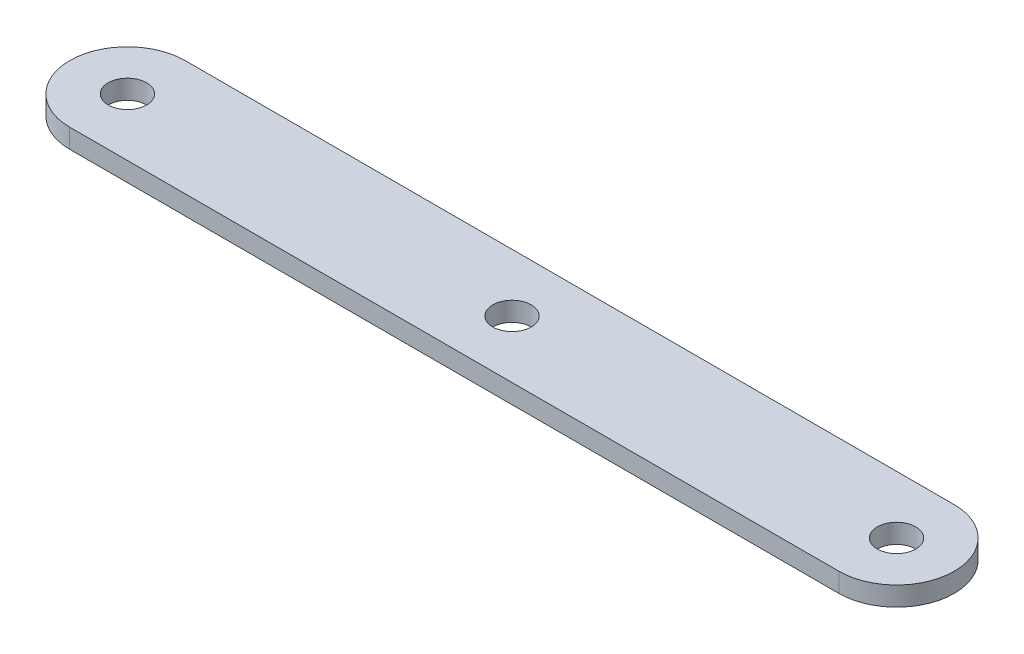
ISO-10303-21;
HEADER;
FILE_DESCRIPTION(('STEP AP214'),'2;1');
FILE_NAME('part.step','',(''),(''),'','','');
FILE_SCHEMA(('AUTOMOTIVE_DESIGN { 1 0 10303 214 1 1 1 1 }'));
ENDSEC;
DATA;
#1=APPLICATION_CONTEXT('core data for automotive mechanical design processes');
#2=APPLICATION_PROTOCOL_DEFINITION('international standard','automotive_design',2000,#1);
#3=PRODUCT_CONTEXT('',#1,'mechanical');
#4=PRODUCT('Part','Part','',(#3));
#5=PRODUCT_RELATED_PRODUCT_CATEGORY('part','',(#4));
#6=PRODUCT_DEFINITION_FORMATION('','',#4);
#7=PRODUCT_DEFINITION_CONTEXT('part definition',#1,'design');
#8=PRODUCT_DEFINITION('design','',#6,#7);
#9=PRODUCT_DEFINITION_SHAPE('','',#8);
#10=(LENGTH_UNIT() NAMED_UNIT(*) SI_UNIT(.MILLI.,.METRE.));
#11=(NAMED_UNIT(*) PLANE_ANGLE_UNIT() SI_UNIT($,.RADIAN.));
#12=(NAMED_UNIT(*) SI_UNIT($,.STERADIAN.) SOLID_ANGLE_UNIT());
#13=UNCERTAINTY_MEASURE_WITH_UNIT(LENGTH_MEASURE(1.E-05),#10,'distance_accuracy_value','');
#14=(GEOMETRIC_REPRESENTATION_CONTEXT(3) GLOBAL_UNCERTAINTY_ASSIGNED_CONTEXT((#13)) GLOBAL_UNIT_ASSIGNED_CONTEXT((#10,
#11,#12)) REPRESENTATION_CONTEXT('',''));
#15=CARTESIAN_POINT('',(0.,0.,0.));
#16=DIRECTION('',(0.,0.,1.));
#17=DIRECTION('',(1.,0.,0.));
#18=AXIS2_PLACEMENT_3D('',#15,#16,#17);
#19=CARTESIAN_POINT('',(0.,5.,0.));
#20=DIRECTION('',(0.,1.,0.));
#21=DIRECTION('',(0.,0.,1.));
#22=AXIS2_PLACEMENT_3D('',#19,#20,#21);
#23=PLANE('',#22);
#24=CARTESIAN_POINT('',(100.,5.,0.));
#25=DIRECTION('',(0.,1.,0.));
#26=DIRECTION('',(0.,0.,1.));
#27=AXIS2_PLACEMENT_3D('',#24,#25,#26);
#28=CIRCLE('',#27,5.);
#29=CARTESIAN_POINT('',(100.,5.,5.));
#30=VERTEX_POINT('',#29);
#31=EDGE_CURVE('E123',#30,#30,#28,.T.);
#32=ORIENTED_EDGE('',*,*,#31,.F.);
#33=EDGE_LOOP('',(#32));
#34=FACE_BOUND('',#33,.T.);
#35=CARTESIAN_POINT('',(0.,5.,0.));
#36=DIRECTION('',(0.,1.,0.));
#37=DIRECTION('',(0.,0.,1.));
#38=AXIS2_PLACEMENT_3D('',#35,#36,#37);
#39=CIRCLE('',#38,15.);
#40=CARTESIAN_POINT('',(0.,5.,-15.));
#41=VERTEX_POINT('',#40);
#42=CARTESIAN_POINT('',(0.,5.,15.));
#43=VERTEX_POINT('',#42);
#44=EDGE_CURVE('E93',#41,#43,#39,.T.);
#45=ORIENTED_EDGE('',*,*,#44,.T.);
#46=DIRECTION('',(1.,0.,0.));
#47=VECTOR('',#46,1.);
#48=CARTESIAN_POINT('',(0.,5.,15.));
#49=LINE('',#48,#47);
#50=CARTESIAN_POINT('',(200.,5.,15.));
#51=VERTEX_POINT('',#50);
#52=EDGE_CURVE('E88',#43,#51,#49,.T.);
#53=ORIENTED_EDGE('',*,*,#52,.T.);
#54=CARTESIAN_POINT('',(200.,5.,0.));
#55=DIRECTION('',(0.,1.,0.));
#56=DIRECTION('',(0.,0.,1.));
#57=AXIS2_PLACEMENT_3D('',#54,#55,#56);
#58=CIRCLE('',#57,15.);
#59=CARTESIAN_POINT('',(200.,5.,-15.));
#60=VERTEX_POINT('',#59);
#61=EDGE_CURVE('E91',#51,#60,#58,.T.);
#62=ORIENTED_EDGE('',*,*,#61,.T.);
#63=DIRECTION('',(-1.,0.,0.));
#64=VECTOR('',#63,1.);
#65=CARTESIAN_POINT('',(0.,5.,-15.));
#66=LINE('',#65,#64);
#67=EDGE_CURVE('E58',#60,#41,#66,.T.);
#68=ORIENTED_EDGE('',*,*,#67,.T.);
#69=EDGE_LOOP('',(#45,#53,#62,#68));
#70=FACE_BOUND('',#69,.T.);
#71=CARTESIAN_POINT('',(200.,5.,0.));
#72=DIRECTION('',(0.,1.,0.));
#73=DIRECTION('',(0.,0.,1.));
#74=AXIS2_PLACEMENT_3D('',#71,#72,#73);
#75=CIRCLE('',#74,4.99999999999999);
#76=CARTESIAN_POINT('',(200.,5.,4.99999999999999));
#77=VERTEX_POINT('',#76);
#78=EDGE_CURVE('E108',#77,#77,#75,.T.);
#79=ORIENTED_EDGE('',*,*,#78,.F.);
#80=EDGE_LOOP('',(#79));
#81=FACE_BOUND('',#80,.T.);
#82=CARTESIAN_POINT('',(0.,5.,0.));
#83=DIRECTION('',(0.,1.,0.));
#84=DIRECTION('',(0.,0.,1.));
#85=AXIS2_PLACEMENT_3D('',#82,#83,#84);
#86=CIRCLE('',#85,5.);
#87=CARTESIAN_POINT('',(0.,5.,5.));
#88=VERTEX_POINT('',#87);
#89=EDGE_CURVE('E129',#88,#88,#86,.T.);
#90=ORIENTED_EDGE('',*,*,#89,.F.);
#91=EDGE_LOOP('',(#90));
#92=FACE_BOUND('',#91,.T.);
#93=ADVANCED_FACE('F41',(#34,#70,#81,#92),#23,.T.);
#94=CARTESIAN_POINT('',(0.,0.,0.));
#95=DIRECTION('',(0.,1.,0.));
#96=DIRECTION('',(0.,0.,1.));
#97=AXIS2_PLACEMENT_3D('',#94,#95,#96);
#98=PLANE('',#97);
#99=CARTESIAN_POINT('',(0.,0.,0.));
#100=DIRECTION('',(0.,1.,0.));
#101=DIRECTION('',(0.,0.,1.));
#102=AXIS2_PLACEMENT_3D('',#99,#100,#101);
#103=CIRCLE('',#102,15.);
#104=CARTESIAN_POINT('',(0.,0.,-15.));
#105=VERTEX_POINT('',#104);
#106=CARTESIAN_POINT('',(0.,0.,15.));
#107=VERTEX_POINT('',#106);
#108=EDGE_CURVE('E105',#105,#107,#103,.T.);
#109=ORIENTED_EDGE('',*,*,#108,.F.);
#110=DIRECTION('',(-1.,0.,0.));
#111=VECTOR('',#110,1.);
#112=CARTESIAN_POINT('',(0.,0.,-15.));
#113=LINE('',#112,#111);
#114=CARTESIAN_POINT('',(200.,0.,-15.));
#115=VERTEX_POINT('',#114);
#116=EDGE_CURVE('E81',#115,#105,#113,.T.);
#117=ORIENTED_EDGE('',*,*,#116,.F.);
#118=CARTESIAN_POINT('',(200.,0.,0.));
#119=DIRECTION('',(0.,1.,0.));
#120=DIRECTION('',(0.,0.,1.));
#121=AXIS2_PLACEMENT_3D('',#118,#119,#120);
#122=CIRCLE('',#121,15.);
#123=CARTESIAN_POINT('',(200.,0.,15.));
#124=VERTEX_POINT('',#123);
#125=EDGE_CURVE('E75',#124,#115,#122,.T.);
#126=ORIENTED_EDGE('',*,*,#125,.F.);
#127=DIRECTION('',(1.,0.,0.));
#128=VECTOR('',#127,1.);
#129=CARTESIAN_POINT('',(0.,0.,15.));
#130=LINE('',#129,#128);
#131=EDGE_CURVE('E97',#107,#124,#130,.T.);
#132=ORIENTED_EDGE('',*,*,#131,.F.);
#133=EDGE_LOOP('',(#109,#117,#126,#132));
#134=FACE_BOUND('',#133,.T.);
#135=CARTESIAN_POINT('',(200.,0.,0.));
#136=DIRECTION('',(0.,1.,0.));
#137=DIRECTION('',(0.,0.,1.));
#138=AXIS2_PLACEMENT_3D('',#135,#136,#137);
#139=CIRCLE('',#138,4.99999999999999);
#140=CARTESIAN_POINT('',(200.,0.,4.99999999999999));
#141=VERTEX_POINT('',#140);
#142=EDGE_CURVE('E120',#141,#141,#139,.T.);
#143=ORIENTED_EDGE('',*,*,#142,.T.);
#144=EDGE_LOOP('',(#143));
#145=FACE_BOUND('',#144,.T.);
#146=CARTESIAN_POINT('',(100.,0.,0.));
#147=DIRECTION('',(0.,1.,0.));
#148=DIRECTION('',(0.,0.,1.));
#149=AXIS2_PLACEMENT_3D('',#146,#147,#148);
#150=CIRCLE('',#149,5.);
#151=CARTESIAN_POINT('',(100.,0.,5.));
#152=VERTEX_POINT('',#151);
#153=EDGE_CURVE('E126',#152,#152,#150,.T.);
#154=ORIENTED_EDGE('',*,*,#153,.T.);
#155=EDGE_LOOP('',(#154));
#156=FACE_BOUND('',#155,.T.);
#157=CARTESIAN_POINT('',(0.,0.,0.));
#158=DIRECTION('',(0.,1.,0.));
#159=DIRECTION('',(0.,0.,1.));
#160=AXIS2_PLACEMENT_3D('',#157,#158,#159);
#161=CIRCLE('',#160,5.);
#162=CARTESIAN_POINT('',(0.,0.,5.));
#163=VERTEX_POINT('',#162);
#164=EDGE_CURVE('E132',#163,#163,#161,.T.);
#165=ORIENTED_EDGE('',*,*,#164,.T.);
#166=EDGE_LOOP('',(#165));
#167=FACE_BOUND('',#166,.T.);
#168=ADVANCED_FACE('F116',(#134,#145,#156,#167),#98,.F.);
#169=CARTESIAN_POINT('',(0.,5.,0.));
#170=DIRECTION('',(0.,-1.,0.));
#171=DIRECTION('',(0.,0.,-1.));
#172=AXIS2_PLACEMENT_3D('',#169,#170,#171);
#173=CYLINDRICAL_SURFACE('',#172,15.);
#174=ORIENTED_EDGE('',*,*,#108,.T.);
#175=DIRECTION('',(0.,-1.,0.));
#176=VECTOR('',#175,1.);
#177=CARTESIAN_POINT('',(0.,5.,15.));
#178=LINE('',#177,#176);
#179=EDGE_CURVE('E11',#43,#107,#178,.T.);
#180=ORIENTED_EDGE('',*,*,#179,.F.);
#181=ORIENTED_EDGE('',*,*,#44,.F.);
#182=DIRECTION('',(0.,-1.,0.));
#183=VECTOR('',#182,1.);
#184=CARTESIAN_POINT('',(0.,5.,-15.));
#185=LINE('',#184,#183);
#186=EDGE_CURVE('E101',#41,#105,#185,.T.);
#187=ORIENTED_EDGE('',*,*,#186,.T.);
#188=EDGE_LOOP('',(#174,#180,#181,#187));
#189=FACE_BOUND('',#188,.T.);
#190=ADVANCED_FACE('F43',(#189),#173,.T.);
#191=CARTESIAN_POINT('',(0.,5.,15.));
#192=DIRECTION('',(0.,0.,-1.));
#193=DIRECTION('',(-1.,0.,0.));
#194=AXIS2_PLACEMENT_3D('',#191,#192,#193);
#195=PLANE('',#194);
#196=ORIENTED_EDGE('',*,*,#131,.T.);
#197=DIRECTION('',(0.,-1.,0.));
#198=VECTOR('',#197,1.);
#199=CARTESIAN_POINT('',(200.,5.,15.));
#200=LINE('',#199,#198);
#201=EDGE_CURVE('E50',#51,#124,#200,.T.);
#202=ORIENTED_EDGE('',*,*,#201,.F.);
#203=ORIENTED_EDGE('',*,*,#52,.F.);
#204=ORIENTED_EDGE('',*,*,#179,.T.);
#205=EDGE_LOOP('',(#196,#202,#203,#204));
#206=FACE_BOUND('',#205,.T.);
#207=ADVANCED_FACE('F96',(#206),#195,.F.);
#208=CARTESIAN_POINT('',(200.,5.,0.));
#209=DIRECTION('',(0.,-1.,0.));
#210=DIRECTION('',(0.,0.,-1.));
#211=AXIS2_PLACEMENT_3D('',#208,#209,#210);
#212=CYLINDRICAL_SURFACE('',#211,15.);
#213=ORIENTED_EDGE('',*,*,#125,.T.);
#214=DIRECTION('',(0.,-1.,0.));
#215=VECTOR('',#214,1.);
#216=CARTESIAN_POINT('',(200.,5.,-15.));
#217=LINE('',#216,#215);
#218=EDGE_CURVE('E98',#60,#115,#217,.T.);
#219=ORIENTED_EDGE('',*,*,#218,.F.);
#220=ORIENTED_EDGE('',*,*,#61,.F.);
#221=ORIENTED_EDGE('',*,*,#201,.T.);
#222=EDGE_LOOP('',(#213,#219,#220,#221));
#223=FACE_BOUND('',#222,.T.);
#224=ADVANCED_FACE('F99',(#223),#212,.T.);
#225=CARTESIAN_POINT('',(0.,5.,-15.));
#226=DIRECTION('',(0.,0.,1.));
#227=DIRECTION('',(1.,0.,0.));
#228=AXIS2_PLACEMENT_3D('',#225,#226,#227);
#229=PLANE('',#228);
#230=ORIENTED_EDGE('',*,*,#116,.T.);
#231=ORIENTED_EDGE('',*,*,#186,.F.);
#232=ORIENTED_EDGE('',*,*,#67,.F.);
#233=ORIENTED_EDGE('',*,*,#218,.T.);
#234=EDGE_LOOP('',(#230,#231,#232,#233));
#235=FACE_BOUND('',#234,.T.);
#236=ADVANCED_FACE('F113',(#235),#229,.F.);
#237=CARTESIAN_POINT('',(200.,5.,0.));
#238=DIRECTION('',(0.,-1.,0.));
#239=DIRECTION('',(0.,0.,-1.));
#240=AXIS2_PLACEMENT_3D('',#237,#238,#239);
#241=CYLINDRICAL_SURFACE('',#240,4.99999999999999);
#242=ORIENTED_EDGE('',*,*,#78,.T.);
#243=EDGE_LOOP('',(#242));
#244=FACE_BOUND('',#243,.T.);
#245=ORIENTED_EDGE('',*,*,#142,.F.);
#246=EDGE_LOOP('',(#245));
#247=FACE_BOUND('',#246,.T.);
#248=ADVANCED_FACE('F150',(#244,#247),#241,.F.);
#249=CARTESIAN_POINT('',(100.,5.,0.));
#250=DIRECTION('',(0.,-1.,0.));
#251=DIRECTION('',(0.,0.,-1.));
#252=AXIS2_PLACEMENT_3D('',#249,#250,#251);
#253=CYLINDRICAL_SURFACE('',#252,5.);
#254=ORIENTED_EDGE('',*,*,#31,.T.);
#255=EDGE_LOOP('',(#254));
#256=FACE_BOUND('',#255,.T.);
#257=ORIENTED_EDGE('',*,*,#153,.F.);
#258=EDGE_LOOP('',(#257));
#259=FACE_BOUND('',#258,.T.);
#260=ADVANCED_FACE('F195',(#256,#259),#253,.F.);
#261=CARTESIAN_POINT('',(0.,5.,0.));
#262=DIRECTION('',(0.,-1.,0.));
#263=DIRECTION('',(0.,0.,-1.));
#264=AXIS2_PLACEMENT_3D('',#261,#262,#263);
#265=CYLINDRICAL_SURFACE('',#264,5.);
#266=ORIENTED_EDGE('',*,*,#89,.T.);
#267=EDGE_LOOP('',(#266));
#268=FACE_BOUND('',#267,.T.);
#269=ORIENTED_EDGE('',*,*,#164,.F.);
#270=EDGE_LOOP('',(#269));
#271=FACE_BOUND('',#270,.T.);
#272=ADVANCED_FACE('F138',(#268,#271),#265,.F.);
#273=CLOSED_SHELL('',(#93,#168,#190,#207,#224,#236,#248,#260,#272));
#274=MANIFOLD_SOLID_BREP('B2',#273);
#275=ADVANCED_BREP_SHAPE_REPRESENTATION('',(#18,#274),#14);
#276=SHAPE_DEFINITION_REPRESENTATION(#9,#275);
ENDSEC;
END-ISO-10303-21;
